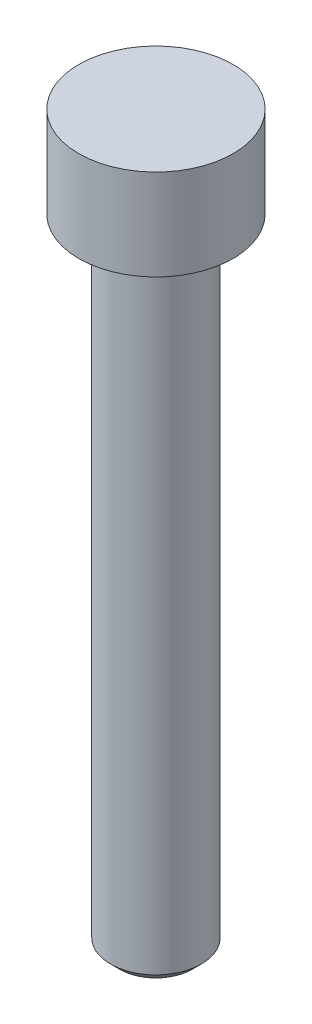
ISO-10303-21;
HEADER;
FILE_DESCRIPTION(('STEP AP214'),'2;1');
FILE_NAME('part.step','',(''),(''),'','','');
FILE_SCHEMA(('AUTOMOTIVE_DESIGN { 1 0 10303 214 1 1 1 1 }'));
ENDSEC;
DATA;
#1=APPLICATION_CONTEXT('core data for automotive mechanical design processes');
#2=APPLICATION_PROTOCOL_DEFINITION('international standard','automotive_design',2000,#1);
#3=PRODUCT_CONTEXT('',#1,'mechanical');
#4=PRODUCT('Part','Part','',(#3));
#5=PRODUCT_RELATED_PRODUCT_CATEGORY('part','',(#4));
#6=PRODUCT_DEFINITION_FORMATION('','',#4);
#7=PRODUCT_DEFINITION_CONTEXT('part definition',#1,'design');
#8=PRODUCT_DEFINITION('design','',#6,#7);
#9=PRODUCT_DEFINITION_SHAPE('','',#8);
#10=(LENGTH_UNIT() NAMED_UNIT(*) SI_UNIT(.MILLI.,.METRE.));
#11=(NAMED_UNIT(*) PLANE_ANGLE_UNIT() SI_UNIT($,.RADIAN.));
#12=(NAMED_UNIT(*) SI_UNIT($,.STERADIAN.) SOLID_ANGLE_UNIT());
#13=UNCERTAINTY_MEASURE_WITH_UNIT(LENGTH_MEASURE(1.E-05),#10,'distance_accuracy_value','');
#14=(GEOMETRIC_REPRESENTATION_CONTEXT(3) GLOBAL_UNCERTAINTY_ASSIGNED_CONTEXT((#13)) GLOBAL_UNIT_ASSIGNED_CONTEXT((#10,
#11,#12)) REPRESENTATION_CONTEXT('',''));
#15=CARTESIAN_POINT('',(0.,0.,0.));
#16=DIRECTION('',(0.,0.,1.));
#17=DIRECTION('',(1.,0.,0.));
#18=AXIS2_PLACEMENT_3D('',#15,#16,#17);
#19=CARTESIAN_POINT('',(0.,5.,0.));
#20=DIRECTION('',(0.,-1.,0.));
#21=DIRECTION('',(0.,0.,-1.));
#22=AXIS2_PLACEMENT_3D('',#19,#20,#21);
#23=CYLINDRICAL_SURFACE('',#22,4.25);
#24=CARTESIAN_POINT('',(0.,5.,0.));
#25=DIRECTION('',(0.,1.,0.));
#26=DIRECTION('',(0.,0.,1.));
#27=AXIS2_PLACEMENT_3D('',#24,#25,#26);
#28=CIRCLE('',#27,4.25);
#29=CARTESIAN_POINT('',(0.,5.,4.25));
#30=VERTEX_POINT('',#29);
#31=EDGE_CURVE('E49',#30,#30,#28,.T.);
#32=ORIENTED_EDGE('',*,*,#31,.F.);
#33=EDGE_LOOP('',(#32));
#34=FACE_BOUND('',#33,.T.);
#35=CARTESIAN_POINT('',(0.,0.,0.));
#36=DIRECTION('',(0.,1.,0.));
#37=DIRECTION('',(0.,0.,1.));
#38=AXIS2_PLACEMENT_3D('',#35,#36,#37);
#39=CIRCLE('',#38,4.25);
#40=CARTESIAN_POINT('',(0.,0.,4.25));
#41=VERTEX_POINT('',#40);
#42=EDGE_CURVE('E52',#41,#41,#39,.T.);
#43=ORIENTED_EDGE('',*,*,#42,.T.);
#44=EDGE_LOOP('',(#43));
#45=FACE_BOUND('',#44,.T.);
#46=ADVANCED_FACE('F33',(#34,#45),#23,.T.);
#47=CARTESIAN_POINT('',(0.,5.,0.));
#48=DIRECTION('',(0.,1.,0.));
#49=DIRECTION('',(0.,0.,1.));
#50=AXIS2_PLACEMENT_3D('',#47,#48,#49);
#51=PLANE('',#50);
#52=ORIENTED_EDGE('',*,*,#31,.T.);
#53=EDGE_LOOP('',(#52));
#54=FACE_BOUND('',#53,.T.);
#55=ADVANCED_FACE('F58',(#54),#51,.T.);
#56=CARTESIAN_POINT('',(0.,0.,0.));
#57=DIRECTION('',(0.,1.,0.));
#58=DIRECTION('',(0.,0.,1.));
#59=AXIS2_PLACEMENT_3D('',#56,#57,#58);
#60=PLANE('',#59);
#61=CARTESIAN_POINT('',(0.,0.,0.));
#62=DIRECTION('',(0.,-1.,0.));
#63=DIRECTION('',(0.,0.,-1.));
#64=AXIS2_PLACEMENT_3D('',#61,#62,#63);
#65=CIRCLE('',#64,2.5);
#66=CARTESIAN_POINT('',(0.,0.,-2.5));
#67=VERTEX_POINT('',#66);
#68=EDGE_CURVE('E45',#67,#67,#65,.T.);
#69=ORIENTED_EDGE('',*,*,#68,.F.);
#70=EDGE_LOOP('',(#69));
#71=FACE_BOUND('',#70,.T.);
#72=ORIENTED_EDGE('',*,*,#42,.F.);
#73=EDGE_LOOP('',(#72));
#74=FACE_BOUND('',#73,.T.);
#75=ADVANCED_FACE('F64',(#71,#74),#60,.F.);
#76=CARTESIAN_POINT('',(0.,-35.,0.));
#77=DIRECTION('',(0.,1.,0.));
#78=DIRECTION('',(0.,0.,1.));
#79=AXIS2_PLACEMENT_3D('',#76,#77,#78);
#80=CYLINDRICAL_SURFACE('',#79,2.5);
#81=CARTESIAN_POINT('',(0.,-34.5,0.));
#82=DIRECTION('',(0.,-1.,0.));
#83=DIRECTION('',(0.,0.,-1.));
#84=AXIS2_PLACEMENT_3D('',#81,#82,#83);
#85=CIRCLE('',#84,2.5);
#86=CARTESIAN_POINT('',(0.,-34.5,-2.5));
#87=VERTEX_POINT('',#86);
#88=EDGE_CURVE('E10',#87,#87,#85,.F.);
#89=ORIENTED_EDGE('',*,*,#88,.T.);
#90=EDGE_LOOP('',(#89));
#91=FACE_BOUND('',#90,.T.);
#92=ORIENTED_EDGE('',*,*,#68,.T.);
#93=EDGE_LOOP('',(#92));
#94=FACE_BOUND('',#93,.T.);
#95=ADVANCED_FACE('F66',(#91,#94),#80,.T.);
#96=CARTESIAN_POINT('',(0.,-35.,0.));
#97=DIRECTION('',(0.,-1.,0.));
#98=DIRECTION('',(0.,0.,-1.));
#99=AXIS2_PLACEMENT_3D('',#96,#97,#98);
#100=PLANE('',#99);
#101=CARTESIAN_POINT('',(0.,-35.,0.));
#102=DIRECTION('',(0.,-1.,0.));
#103=DIRECTION('',(0.,0.,-1.));
#104=AXIS2_PLACEMENT_3D('',#101,#102,#103);
#105=CIRCLE('',#104,2.);
#106=CARTESIAN_POINT('',(0.,-35.,-2.));
#107=VERTEX_POINT('',#106);
#108=EDGE_CURVE('E41',#107,#107,#105,.T.);
#109=ORIENTED_EDGE('',*,*,#108,.T.);
#110=EDGE_LOOP('',(#109));
#111=FACE_BOUND('',#110,.T.);
#112=ADVANCED_FACE('F73',(#111),#100,.T.);
#113=CARTESIAN_POINT('',(0.,-35.,0.));
#114=DIRECTION('',(0.,1.,0.));
#115=DIRECTION('',(0.,0.,1.));
#116=AXIS2_PLACEMENT_3D('',#113,#114,#115);
#117=CONICAL_SURFACE('',#116,2.,0.785398163397443);
#118=ORIENTED_EDGE('',*,*,#88,.F.);
#119=EDGE_LOOP('',(#118));
#120=FACE_BOUND('',#119,.T.);
#121=ORIENTED_EDGE('',*,*,#108,.F.);
#122=EDGE_LOOP('',(#121));
#123=FACE_BOUND('',#122,.T.);
#124=ADVANCED_FACE('F36',(#120,#123),#117,.T.);
#125=CLOSED_SHELL('',(#46,#55,#75,#95,#112,#124));
#126=MANIFOLD_SOLID_BREP('B2',#125);
#127=ADVANCED_BREP_SHAPE_REPRESENTATION('',(#18,#126),#14);
#128=SHAPE_DEFINITION_REPRESENTATION(#9,#127);
ENDSEC;
END-ISO-10303-21;
